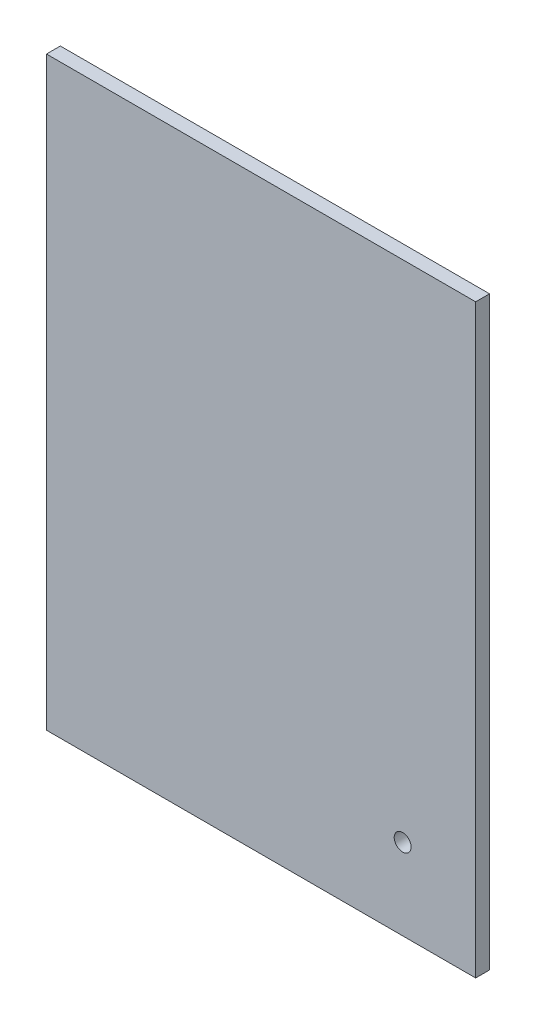
ISO-10303-21;
HEADER;
FILE_DESCRIPTION(('STEP AP214'),'2;1');
FILE_NAME('part.step','',(''),(''),'','','');
FILE_SCHEMA(('AUTOMOTIVE_DESIGN { 1 0 10303 214 1 1 1 1 }'));
ENDSEC;
DATA;
#1=APPLICATION_CONTEXT('core data for automotive mechanical design processes');
#2=APPLICATION_PROTOCOL_DEFINITION('international standard','automotive_design',2000,#1);
#3=PRODUCT_CONTEXT('',#1,'mechanical');
#4=PRODUCT('Part','Part','',(#3));
#5=PRODUCT_RELATED_PRODUCT_CATEGORY('part','',(#4));
#6=PRODUCT_DEFINITION_FORMATION('','',#4);
#7=PRODUCT_DEFINITION_CONTEXT('part definition',#1,'design');
#8=PRODUCT_DEFINITION('design','',#6,#7);
#9=PRODUCT_DEFINITION_SHAPE('','',#8);
#10=(LENGTH_UNIT() NAMED_UNIT(*) SI_UNIT(.MILLI.,.METRE.));
#11=(NAMED_UNIT(*) PLANE_ANGLE_UNIT() SI_UNIT($,.RADIAN.));
#12=(NAMED_UNIT(*) SI_UNIT($,.STERADIAN.) SOLID_ANGLE_UNIT());
#13=UNCERTAINTY_MEASURE_WITH_UNIT(LENGTH_MEASURE(1.E-05),#10,'distance_accuracy_value','');
#14=(GEOMETRIC_REPRESENTATION_CONTEXT(3) GLOBAL_UNCERTAINTY_ASSIGNED_CONTEXT((#13)) GLOBAL_UNIT_ASSIGNED_CONTEXT((#10,
#11,#12)) REPRESENTATION_CONTEXT('',''));
#15=CARTESIAN_POINT('',(0.,0.,0.));
#16=DIRECTION('',(0.,0.,1.));
#17=DIRECTION('',(1.,0.,0.));
#18=AXIS2_PLACEMENT_3D('',#15,#16,#17);
#19=CARTESIAN_POINT('',(0.,760.,18.));
#20=DIRECTION('',(0.,1.,0.));
#21=DIRECTION('',(0.,0.,1.));
#22=AXIS2_PLACEMENT_3D('',#19,#20,#21);
#23=PLANE('',#22);
#24=DIRECTION('',(1.,0.,0.));
#25=VECTOR('',#24,1.);
#26=CARTESIAN_POINT('',(0.,760.,0.));
#27=LINE('',#26,#25);
#28=CARTESIAN_POINT('',(0.,760.,0.));
#29=VERTEX_POINT('',#28);
#30=CARTESIAN_POINT('',(557.,760.,0.));
#31=VERTEX_POINT('',#30);
#32=EDGE_CURVE('E100',#29,#31,#27,.T.);
#33=ORIENTED_EDGE('',*,*,#32,.F.);
#34=DIRECTION('',(0.,0.,-1.));
#35=VECTOR('',#34,1.);
#36=CARTESIAN_POINT('',(0.,760.,18.));
#37=LINE('',#36,#35);
#38=CARTESIAN_POINT('',(0.,760.,18.));
#39=VERTEX_POINT('',#38);
#40=EDGE_CURVE('E11',#39,#29,#37,.T.);
#41=ORIENTED_EDGE('',*,*,#40,.F.);
#42=DIRECTION('',(1.,0.,0.));
#43=VECTOR('',#42,1.);
#44=CARTESIAN_POINT('',(0.,760.,18.));
#45=LINE('',#44,#43);
#46=CARTESIAN_POINT('',(557.,760.,18.));
#47=VERTEX_POINT('',#46);
#48=EDGE_CURVE('E94',#39,#47,#45,.T.);
#49=ORIENTED_EDGE('',*,*,#48,.T.);
#50=DIRECTION('',(0.,0.,-1.));
#51=VECTOR('',#50,1.);
#52=CARTESIAN_POINT('',(557.,760.,18.));
#53=LINE('',#52,#51);
#54=EDGE_CURVE('E37',#47,#31,#53,.T.);
#55=ORIENTED_EDGE('',*,*,#54,.T.);
#56=EDGE_LOOP('',(#33,#41,#49,#55));
#57=FACE_BOUND('',#56,.T.);
#58=ADVANCED_FACE('F34',(#57),#23,.T.);
#59=CARTESIAN_POINT('',(0.,760.,18.));
#60=DIRECTION('',(1.,0.,0.));
#61=DIRECTION('',(0.,0.,-1.));
#62=AXIS2_PLACEMENT_3D('',#59,#60,#61);
#63=PLANE('',#62);
#64=DIRECTION('',(0.,-1.,0.));
#65=VECTOR('',#64,1.);
#66=CARTESIAN_POINT('',(0.,760.,0.));
#67=LINE('',#66,#65);
#68=CARTESIAN_POINT('',(0.,0.,0.));
#69=VERTEX_POINT('',#68);
#70=EDGE_CURVE('E67',#29,#69,#67,.T.);
#71=ORIENTED_EDGE('',*,*,#70,.T.);
#72=DIRECTION('',(0.,0.,-1.));
#73=VECTOR('',#72,1.);
#74=CARTESIAN_POINT('',(0.,0.,18.));
#75=LINE('',#74,#73);
#76=CARTESIAN_POINT('',(0.,0.,18.));
#77=VERTEX_POINT('',#76);
#78=EDGE_CURVE('E43',#77,#69,#75,.T.);
#79=ORIENTED_EDGE('',*,*,#78,.F.);
#80=DIRECTION('',(0.,-1.,0.));
#81=VECTOR('',#80,1.);
#82=CARTESIAN_POINT('',(0.,760.,18.));
#83=LINE('',#82,#81);
#84=EDGE_CURVE('E84',#39,#77,#83,.T.);
#85=ORIENTED_EDGE('',*,*,#84,.F.);
#86=ORIENTED_EDGE('',*,*,#40,.T.);
#87=EDGE_LOOP('',(#71,#79,#85,#86));
#88=FACE_BOUND('',#87,.T.);
#89=ADVANCED_FACE('F111',(#88),#63,.F.);
#90=CARTESIAN_POINT('',(0.,0.,18.));
#91=DIRECTION('',(0.,1.,0.));
#92=DIRECTION('',(0.,0.,1.));
#93=AXIS2_PLACEMENT_3D('',#90,#91,#92);
#94=PLANE('',#93);
#95=DIRECTION('',(1.,0.,0.));
#96=VECTOR('',#95,1.);
#97=CARTESIAN_POINT('',(0.,0.,0.));
#98=LINE('',#97,#96);
#99=CARTESIAN_POINT('',(557.,0.,0.));
#100=VERTEX_POINT('',#99);
#101=EDGE_CURVE('E91',#69,#100,#98,.T.);
#102=ORIENTED_EDGE('',*,*,#101,.T.);
#103=DIRECTION('',(0.,0.,-1.));
#104=VECTOR('',#103,1.);
#105=CARTESIAN_POINT('',(557.,0.,18.));
#106=LINE('',#105,#104);
#107=CARTESIAN_POINT('',(557.,0.,18.));
#108=VERTEX_POINT('',#107);
#109=EDGE_CURVE('E88',#108,#100,#106,.T.);
#110=ORIENTED_EDGE('',*,*,#109,.F.);
#111=DIRECTION('',(1.,0.,0.));
#112=VECTOR('',#111,1.);
#113=CARTESIAN_POINT('',(0.,0.,18.));
#114=LINE('',#113,#112);
#115=EDGE_CURVE('E79',#77,#108,#114,.T.);
#116=ORIENTED_EDGE('',*,*,#115,.F.);
#117=ORIENTED_EDGE('',*,*,#78,.T.);
#118=EDGE_LOOP('',(#102,#110,#116,#117));
#119=FACE_BOUND('',#118,.T.);
#120=ADVANCED_FACE('F89',(#119),#94,.F.);
#121=CARTESIAN_POINT('',(557.,760.,18.));
#122=DIRECTION('',(1.,0.,0.));
#123=DIRECTION('',(0.,1.,0.));
#124=AXIS2_PLACEMENT_3D('',#121,#122,#123);
#125=PLANE('',#124);
#126=DIRECTION('',(0.,-1.,0.));
#127=VECTOR('',#126,1.);
#128=CARTESIAN_POINT('',(557.,760.,0.));
#129=LINE('',#128,#127);
#130=EDGE_CURVE('E103',#31,#100,#129,.T.);
#131=ORIENTED_EDGE('',*,*,#130,.F.);
#132=ORIENTED_EDGE('',*,*,#54,.F.);
#133=DIRECTION('',(0.,-1.,0.));
#134=VECTOR('',#133,1.);
#135=CARTESIAN_POINT('',(557.,760.,18.));
#136=LINE('',#135,#134);
#137=EDGE_CURVE('E83',#47,#108,#136,.T.);
#138=ORIENTED_EDGE('',*,*,#137,.T.);
#139=ORIENTED_EDGE('',*,*,#109,.T.);
#140=EDGE_LOOP('',(#131,#132,#138,#139));
#141=FACE_BOUND('',#140,.T.);
#142=ADVANCED_FACE('F93',(#141),#125,.T.);
#143=CARTESIAN_POINT('',(0.,0.,18.));
#144=DIRECTION('',(0.,0.,-1.));
#145=DIRECTION('',(-1.,0.,0.));
#146=AXIS2_PLACEMENT_3D('',#143,#144,#145);
#147=PLANE('',#146);
#148=CARTESIAN_POINT('',(462.254159230177,105.191540972183,18.));
#149=DIRECTION('',(0.,0.,1.));
#150=DIRECTION('',(1.,0.,0.));
#151=AXIS2_PLACEMENT_3D('',#148,#149,#150);
#152=CIRCLE('',#151,10.9703975659807);
#153=CARTESIAN_POINT('',(473.224556796157,105.191540972183,18.));
#154=VERTEX_POINT('',#153);
#155=EDGE_CURVE('E104',#154,#154,#152,.T.);
#156=ORIENTED_EDGE('',*,*,#155,.F.);
#157=EDGE_LOOP('',(#156));
#158=FACE_BOUND('',#157,.T.);
#159=ORIENTED_EDGE('',*,*,#48,.F.);
#160=ORIENTED_EDGE('',*,*,#84,.T.);
#161=ORIENTED_EDGE('',*,*,#115,.T.);
#162=ORIENTED_EDGE('',*,*,#137,.F.);
#163=EDGE_LOOP('',(#159,#160,#161,#162));
#164=FACE_BOUND('',#163,.T.);
#165=ADVANCED_FACE('F82',(#158,#164),#147,.F.);
#166=CARTESIAN_POINT('',(0.,0.,0.));
#167=DIRECTION('',(0.,0.,-1.));
#168=DIRECTION('',(-1.,0.,0.));
#169=AXIS2_PLACEMENT_3D('',#166,#167,#168);
#170=PLANE('',#169);
#171=CARTESIAN_POINT('',(462.254159230177,105.191540972183,0.));
#172=DIRECTION('',(0.,0.,-1.));
#173=DIRECTION('',(-1.,0.,0.));
#174=AXIS2_PLACEMENT_3D('',#171,#172,#173);
#175=CIRCLE('',#174,10.9703975659807);
#176=CARTESIAN_POINT('',(451.283761664196,105.191540972183,0.));
#177=VERTEX_POINT('',#176);
#178=EDGE_CURVE('E142',#177,#177,#175,.F.);
#179=ORIENTED_EDGE('',*,*,#178,.T.);
#180=EDGE_LOOP('',(#179));
#181=FACE_BOUND('',#180,.T.);
#182=ORIENTED_EDGE('',*,*,#32,.T.);
#183=ORIENTED_EDGE('',*,*,#130,.T.);
#184=ORIENTED_EDGE('',*,*,#101,.F.);
#185=ORIENTED_EDGE('',*,*,#70,.F.);
#186=EDGE_LOOP('',(#182,#183,#184,#185));
#187=FACE_BOUND('',#186,.T.);
#188=ADVANCED_FACE('F109',(#181,#187),#170,.T.);
#189=CARTESIAN_POINT('',(462.254159230177,105.191540972183,-0.001000000000001));
#190=DIRECTION('',(0.,0.,1.));
#191=DIRECTION('',(1.,0.,0.));
#192=AXIS2_PLACEMENT_3D('',#189,#190,#191);
#193=CYLINDRICAL_SURFACE('',#192,10.9703975659807);
#194=ORIENTED_EDGE('',*,*,#178,.F.);
#195=EDGE_LOOP('',(#194));
#196=FACE_BOUND('',#195,.T.);
#197=ORIENTED_EDGE('',*,*,#155,.T.);
#198=EDGE_LOOP('',(#197));
#199=FACE_BOUND('',#198,.T.);
#200=ADVANCED_FACE('F130',(#196,#199),#193,.F.);
#201=CLOSED_SHELL('',(#58,#89,#120,#142,#165,#188,#200));
#202=MANIFOLD_SOLID_BREP('B2',#201);
#203=ADVANCED_BREP_SHAPE_REPRESENTATION('',(#18,#202),#14);
#204=SHAPE_DEFINITION_REPRESENTATION(#9,#203);
ENDSEC;
END-ISO-10303-21;
